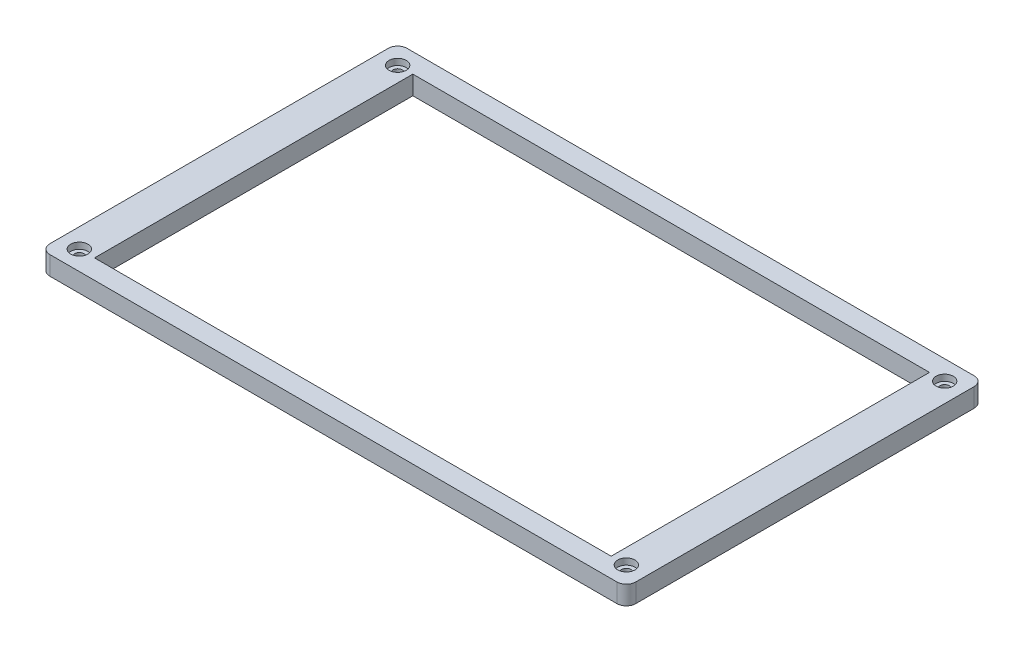
ISO-10303-21;
HEADER;
FILE_DESCRIPTION(('STEP AP214'),'2;1');
FILE_NAME('part.step','',(''),(''),'','','');
FILE_SCHEMA(('AUTOMOTIVE_DESIGN { 1 0 10303 214 1 1 1 1 }'));
ENDSEC;
DATA;
#1=APPLICATION_CONTEXT('core data for automotive mechanical design processes');
#2=APPLICATION_PROTOCOL_DEFINITION('international standard','automotive_design',2000,#1);
#3=PRODUCT_CONTEXT('',#1,'mechanical');
#4=PRODUCT('Part','Part','',(#3));
#5=PRODUCT_RELATED_PRODUCT_CATEGORY('part','',(#4));
#6=PRODUCT_DEFINITION_FORMATION('','',#4);
#7=PRODUCT_DEFINITION_CONTEXT('part definition',#1,'design');
#8=PRODUCT_DEFINITION('design','',#6,#7);
#9=PRODUCT_DEFINITION_SHAPE('','',#8);
#10=(LENGTH_UNIT() NAMED_UNIT(*) SI_UNIT(.MILLI.,.METRE.));
#11=(NAMED_UNIT(*) PLANE_ANGLE_UNIT() SI_UNIT($,.RADIAN.));
#12=(NAMED_UNIT(*) SI_UNIT($,.STERADIAN.) SOLID_ANGLE_UNIT());
#13=UNCERTAINTY_MEASURE_WITH_UNIT(LENGTH_MEASURE(1.E-05),#10,'distance_accuracy_value','');
#14=(GEOMETRIC_REPRESENTATION_CONTEXT(3) GLOBAL_UNCERTAINTY_ASSIGNED_CONTEXT((#13)) GLOBAL_UNIT_ASSIGNED_CONTEXT((#10,
#11,#12)) REPRESENTATION_CONTEXT('',''));
#15=CARTESIAN_POINT('',(0.,0.,0.));
#16=DIRECTION('',(0.,0.,1.));
#17=DIRECTION('',(1.,0.,0.));
#18=AXIS2_PLACEMENT_3D('',#15,#16,#17);
#19=CARTESIAN_POINT('',(87.5005621134574,0.,46.7348927078916));
#20=DIRECTION('',(0.,1.,0.));
#21=DIRECTION('',(0.,0.,1.));
#22=AXIS2_PLACEMENT_3D('',#19,#20,#21);
#23=CYLINDRICAL_SURFACE('',#22,1.5);
#24=CARTESIAN_POINT('',(87.5005621134574,0.,46.7348927078916));
#25=DIRECTION('',(0.,1.,0.));
#26=DIRECTION('',(0.,0.,1.));
#27=AXIS2_PLACEMENT_3D('',#24,#25,#26);
#28=CIRCLE('',#27,1.5);
#29=CARTESIAN_POINT('',(87.5005621134574,0.,48.2348927078916));
#30=VERTEX_POINT('',#29);
#31=EDGE_CURVE('E149',#30,#30,#28,.T.);
#32=ORIENTED_EDGE('',*,*,#31,.F.);
#33=EDGE_LOOP('',(#32));
#34=FACE_BOUND('',#33,.T.);
#35=CARTESIAN_POINT('',(87.5005621134574,4.,46.7348927078916));
#36=DIRECTION('',(0.,1.,0.));
#37=DIRECTION('',(0.,0.,1.));
#38=AXIS2_PLACEMENT_3D('',#35,#36,#37);
#39=CIRCLE('',#38,1.5);
#40=CARTESIAN_POINT('',(87.5005621134574,4.,48.2348927078916));
#41=VERTEX_POINT('',#40);
#42=EDGE_CURVE('E39',#41,#41,#39,.F.);
#43=ORIENTED_EDGE('',*,*,#42,.F.);
#44=EDGE_LOOP('',(#43));
#45=FACE_BOUND('',#44,.T.);
#46=ADVANCED_FACE('F35',(#34,#45),#23,.F.);
#47=CARTESIAN_POINT('',(-87.1001338479327,0.,-54.8655136929024));
#48=DIRECTION('',(0.,1.,0.));
#49=DIRECTION('',(0.,0.,1.));
#50=AXIS2_PLACEMENT_3D('',#47,#48,#49);
#51=CYLINDRICAL_SURFACE('',#50,1.5);
#52=CARTESIAN_POINT('',(-87.1001338479327,0.,-54.8655136929024));
#53=DIRECTION('',(0.,1.,0.));
#54=DIRECTION('',(0.,0.,1.));
#55=AXIS2_PLACEMENT_3D('',#52,#53,#54);
#56=CIRCLE('',#55,1.5);
#57=CARTESIAN_POINT('',(-87.1001338479327,0.,-53.3655136929024));
#58=VERTEX_POINT('',#57);
#59=EDGE_CURVE('E232',#58,#58,#56,.T.);
#60=ORIENTED_EDGE('',*,*,#59,.F.);
#61=EDGE_LOOP('',(#60));
#62=FACE_BOUND('',#61,.T.);
#63=CARTESIAN_POINT('',(-87.1001338479327,4.,-54.8655136929024));
#64=DIRECTION('',(0.,1.,0.));
#65=DIRECTION('',(0.,0.,1.));
#66=AXIS2_PLACEMENT_3D('',#63,#64,#65);
#67=CIRCLE('',#66,1.5);
#68=CARTESIAN_POINT('',(-87.1001338479327,4.,-53.3655136929024));
#69=VERTEX_POINT('',#68);
#70=EDGE_CURVE('E227',#69,#69,#67,.F.);
#71=ORIENTED_EDGE('',*,*,#70,.F.);
#72=EDGE_LOOP('',(#71));
#73=FACE_BOUND('',#72,.T.);
#74=ADVANCED_FACE('F255',(#62,#73),#51,.F.);
#75=CARTESIAN_POINT('',(-93.2997858672377,6.,-61.0653104925054));
#76=DIRECTION('',(1.,0.,0.));
#77=DIRECTION('',(0.,0.,-1.));
#78=AXIS2_PLACEMENT_3D('',#75,#76,#77);
#79=PLANE('',#78);
#80=DIRECTION('',(0.,0.,1.));
#81=VECTOR('',#80,1.);
#82=CARTESIAN_POINT('',(-93.2997858672377,6.,-61.0653104925054));
#83=LINE('',#82,#81);
#84=CARTESIAN_POINT('',(-93.2997858672377,6.,-58.0653104925054));
#85=VERTEX_POINT('',#84);
#86=CARTESIAN_POINT('',(-93.2997858672376,6.,49.9346895074946));
#87=VERTEX_POINT('',#86);
#88=EDGE_CURVE('E165',#85,#87,#83,.T.);
#89=ORIENTED_EDGE('',*,*,#88,.F.);
#90=DIRECTION('',(0.,-1.,0.));
#91=VECTOR('',#90,1.);
#92=CARTESIAN_POINT('',(-93.2997858672377,6.,-58.0653104925054));
#93=LINE('',#92,#91);
#94=CARTESIAN_POINT('',(-93.2997858672377,0.,-58.0653104925054));
#95=VERTEX_POINT('',#94);
#96=EDGE_CURVE('E190',#85,#95,#93,.T.);
#97=ORIENTED_EDGE('',*,*,#96,.T.);
#98=DIRECTION('',(0.,0.,1.));
#99=VECTOR('',#98,1.);
#100=CARTESIAN_POINT('',(-93.2997858672377,0.,-61.0653104925054));
#101=LINE('',#100,#99);
#102=CARTESIAN_POINT('',(-93.2997858672376,0.,49.9346895074946));
#103=VERTEX_POINT('',#102);
#104=EDGE_CURVE('E161',#95,#103,#101,.T.);
#105=ORIENTED_EDGE('',*,*,#104,.T.);
#106=DIRECTION('',(0.,-1.,0.));
#107=VECTOR('',#106,1.);
#108=CARTESIAN_POINT('',(-93.2997858672376,6.,49.9346895074946));
#109=LINE('',#108,#107);
#110=EDGE_CURVE('E178',#103,#87,#109,.F.);
#111=ORIENTED_EDGE('',*,*,#110,.T.);
#112=EDGE_LOOP('',(#89,#97,#105,#111));
#113=FACE_BOUND('',#112,.T.);
#114=ADVANCED_FACE('F261',(#113),#79,.F.);
#115=CARTESIAN_POINT('',(-93.2997858672376,6.,52.9346895074947));
#116=DIRECTION('',(0.,0.,-1.));
#117=DIRECTION('',(-1.,0.,0.));
#118=AXIS2_PLACEMENT_3D('',#115,#116,#117);
#119=PLANE('',#118);
#120=DIRECTION('',(1.,0.,0.));
#121=VECTOR('',#120,1.);
#122=CARTESIAN_POINT('',(-93.2997858672376,0.,52.9346895074947));
#123=LINE('',#122,#121);
#124=CARTESIAN_POINT('',(-90.2997858672376,0.,52.9346895074947));
#125=VERTEX_POINT('',#124);
#126=CARTESIAN_POINT('',(90.7002141327624,0.,52.9346895074947));
#127=VERTEX_POINT('',#126);
#128=EDGE_CURVE('E181',#125,#127,#123,.T.);
#129=ORIENTED_EDGE('',*,*,#128,.T.);
#130=DIRECTION('',(0.,-1.,0.));
#131=VECTOR('',#130,1.);
#132=CARTESIAN_POINT('',(90.7002141327624,6.,52.9346895074947));
#133=LINE('',#132,#131);
#134=CARTESIAN_POINT('',(90.7002141327624,6.,52.9346895074947));
#135=VERTEX_POINT('',#134);
#136=EDGE_CURVE('E11',#127,#135,#133,.F.);
#137=ORIENTED_EDGE('',*,*,#136,.T.);
#138=DIRECTION('',(1.,0.,0.));
#139=VECTOR('',#138,1.);
#140=CARTESIAN_POINT('',(-93.2997858672376,6.,52.9346895074947));
#141=LINE('',#140,#139);
#142=CARTESIAN_POINT('',(-90.2997858672376,6.,52.9346895074947));
#143=VERTEX_POINT('',#142);
#144=EDGE_CURVE('E168',#143,#135,#141,.T.);
#145=ORIENTED_EDGE('',*,*,#144,.F.);
#146=DIRECTION('',(0.,-1.,0.));
#147=VECTOR('',#146,1.);
#148=CARTESIAN_POINT('',(-90.2997858672376,6.,52.9346895074947));
#149=LINE('',#148,#147);
#150=EDGE_CURVE('E44',#143,#125,#149,.T.);
#151=ORIENTED_EDGE('',*,*,#150,.T.);
#152=EDGE_LOOP('',(#129,#137,#145,#151));
#153=FACE_BOUND('',#152,.T.);
#154=ADVANCED_FACE('F292',(#153),#119,.F.);
#155=CARTESIAN_POINT('',(93.7002141327623,6.,-61.0653104925054));
#156=DIRECTION('',(-1.,0.,0.));
#157=DIRECTION('',(0.,0.,1.));
#158=AXIS2_PLACEMENT_3D('',#155,#156,#157);
#159=PLANE('',#158);
#160=DIRECTION('',(0.,0.,-1.));
#161=VECTOR('',#160,1.);
#162=CARTESIAN_POINT('',(93.7002141327623,0.,-61.0653104925054));
#163=LINE('',#162,#161);
#164=CARTESIAN_POINT('',(93.7002141327623,0.,49.9346895074946));
#165=VERTEX_POINT('',#164);
#166=CARTESIAN_POINT('',(93.7002141327623,0.,-58.0653104925054));
#167=VERTEX_POINT('',#166);
#168=EDGE_CURVE('E184',#165,#167,#163,.T.);
#169=ORIENTED_EDGE('',*,*,#168,.T.);
#170=DIRECTION('',(0.,-1.,0.));
#171=VECTOR('',#170,1.);
#172=CARTESIAN_POINT('',(93.7002141327623,6.,-58.0653104925054));
#173=LINE('',#172,#171);
#174=CARTESIAN_POINT('',(93.7002141327623,6.,-58.0653104925054));
#175=VERTEX_POINT('',#174);
#176=EDGE_CURVE('E217',#167,#175,#173,.F.);
#177=ORIENTED_EDGE('',*,*,#176,.T.);
#178=DIRECTION('',(0.,0.,-1.));
#179=VECTOR('',#178,1.);
#180=CARTESIAN_POINT('',(93.7002141327623,6.,-61.0653104925054));
#181=LINE('',#180,#179);
#182=CARTESIAN_POINT('',(93.7002141327623,6.,49.9346895074946));
#183=VERTEX_POINT('',#182);
#184=EDGE_CURVE('E172',#183,#175,#181,.T.);
#185=ORIENTED_EDGE('',*,*,#184,.F.);
#186=DIRECTION('',(0.,-1.,0.));
#187=VECTOR('',#186,1.);
#188=CARTESIAN_POINT('',(93.7002141327623,6.,49.9346895074946));
#189=LINE('',#188,#187);
#190=EDGE_CURVE('E214',#183,#165,#189,.T.);
#191=ORIENTED_EDGE('',*,*,#190,.T.);
#192=EDGE_LOOP('',(#169,#177,#185,#191));
#193=FACE_BOUND('',#192,.T.);
#194=ADVANCED_FACE('F288',(#193),#159,.F.);
#195=CARTESIAN_POINT('',(-93.2997858672377,6.,-61.0653104925054));
#196=DIRECTION('',(0.,0.,1.));
#197=DIRECTION('',(1.,0.,0.));
#198=AXIS2_PLACEMENT_3D('',#195,#196,#197);
#199=PLANE('',#198);
#200=DIRECTION('',(-1.,0.,0.));
#201=VECTOR('',#200,1.);
#202=CARTESIAN_POINT('',(-93.2997858672377,0.,-61.0653104925054));
#203=LINE('',#202,#201);
#204=CARTESIAN_POINT('',(90.7002141327623,0.,-61.0653104925054));
#205=VERTEX_POINT('',#204);
#206=CARTESIAN_POINT('',(-90.2997858672377,0.,-61.0653104925054));
#207=VERTEX_POINT('',#206);
#208=EDGE_CURVE('E169',#205,#207,#203,.T.);
#209=ORIENTED_EDGE('',*,*,#208,.T.);
#210=DIRECTION('',(0.,-1.,0.));
#211=VECTOR('',#210,1.);
#212=CARTESIAN_POINT('',(-90.2997858672377,6.,-61.0653104925054));
#213=LINE('',#212,#211);
#214=CARTESIAN_POINT('',(-90.2997858672377,6.,-61.0653104925054));
#215=VERTEX_POINT('',#214);
#216=EDGE_CURVE('E204',#207,#215,#213,.F.);
#217=ORIENTED_EDGE('',*,*,#216,.T.);
#218=DIRECTION('',(-1.,0.,0.));
#219=VECTOR('',#218,1.);
#220=CARTESIAN_POINT('',(-93.2997858672377,6.,-61.0653104925054));
#221=LINE('',#220,#219);
#222=CARTESIAN_POINT('',(90.7002141327623,6.,-61.0653104925054));
#223=VERTEX_POINT('',#222);
#224=EDGE_CURVE('E175',#223,#215,#221,.T.);
#225=ORIENTED_EDGE('',*,*,#224,.F.);
#226=DIRECTION('',(0.,-1.,0.));
#227=VECTOR('',#226,1.);
#228=CARTESIAN_POINT('',(90.7002141327623,6.,-61.0653104925054));
#229=LINE('',#228,#227);
#230=EDGE_CURVE('E201',#223,#205,#229,.T.);
#231=ORIENTED_EDGE('',*,*,#230,.T.);
#232=EDGE_LOOP('',(#209,#217,#225,#231));
#233=FACE_BOUND('',#232,.T.);
#234=ADVANCED_FACE('F282',(#233),#199,.F.);
#235=CARTESIAN_POINT('',(0.,6.,0.));
#236=DIRECTION('',(0.,1.,0.));
#237=DIRECTION('',(0.,0.,1.));
#238=AXIS2_PLACEMENT_3D('',#235,#236,#237);
#239=PLANE('',#238);
#240=CARTESIAN_POINT('',(87.5002141327624,6.,-54.8653104925054));
#241=DIRECTION('',(0.,1.,0.));
#242=DIRECTION('',(0.,0.,-1.));
#243=AXIS2_PLACEMENT_3D('',#240,#241,#242);
#244=CIRCLE('',#243,2.75000000000001);
#245=CARTESIAN_POINT('',(87.5002141327624,6.,-57.6153104925054));
#246=VERTEX_POINT('',#245);
#247=EDGE_CURVE('E475',#246,#246,#244,.T.);
#248=ORIENTED_EDGE('',*,*,#247,.F.);
#249=EDGE_LOOP('',(#248));
#250=FACE_BOUND('',#249,.T.);
#251=CARTESIAN_POINT('',(-87.0997858672376,6.,46.7346895074947));
#252=DIRECTION('',(0.,1.,0.));
#253=DIRECTION('',(0.,0.,-1.));
#254=AXIS2_PLACEMENT_3D('',#251,#252,#253);
#255=CIRCLE('',#254,2.75000000000001);
#256=CARTESIAN_POINT('',(-87.0997858672376,6.,43.9846895074947));
#257=VERTEX_POINT('',#256);
#258=EDGE_CURVE('E469',#257,#257,#255,.T.);
#259=ORIENTED_EDGE('',*,*,#258,.F.);
#260=EDGE_LOOP('',(#259));
#261=FACE_BOUND('',#260,.T.);
#262=CARTESIAN_POINT('',(87.5002141327624,6.,46.7346895074947));
#263=DIRECTION('',(0.,1.,0.));
#264=DIRECTION('',(0.,0.,1.));
#265=AXIS2_PLACEMENT_3D('',#262,#263,#264);
#266=CIRCLE('',#265,2.75000000000001);
#267=CARTESIAN_POINT('',(87.5002141327624,6.,49.4846895074947));
#268=VERTEX_POINT('',#267);
#269=EDGE_CURVE('E466',#268,#268,#266,.T.);
#270=ORIENTED_EDGE('',*,*,#269,.F.);
#271=EDGE_LOOP('',(#270));
#272=FACE_BOUND('',#271,.T.);
#273=CARTESIAN_POINT('',(-87.0997858672376,6.,-54.8653104925054));
#274=DIRECTION('',(0.,1.,0.));
#275=DIRECTION('',(0.,0.,1.));
#276=AXIS2_PLACEMENT_3D('',#273,#274,#275);
#277=CIRCLE('',#276,2.75000000000001);
#278=CARTESIAN_POINT('',(-87.0997858672376,6.,-52.1153104925053));
#279=VERTEX_POINT('',#278);
#280=EDGE_CURVE('E244',#279,#279,#277,.T.);
#281=ORIENTED_EDGE('',*,*,#280,.F.);
#282=EDGE_LOOP('',(#281));
#283=FACE_BOUND('',#282,.T.);
#284=DIRECTION('',(0.,0.,1.));
#285=VECTOR('',#284,1.);
#286=CARTESIAN_POINT('',(-82.2494378865426,6.,-54.8653104925053));
#287=LINE('',#286,#285);
#288=CARTESIAN_POINT('',(-82.2494378865426,6.,-54.8653104925053));
#289=VERTEX_POINT('',#288);
#290=CARTESIAN_POINT('',(-82.2494378865426,6.,46.7346895074946));
#291=VERTEX_POINT('',#290);
#292=EDGE_CURVE('E52',#289,#291,#287,.T.);
#293=ORIENTED_EDGE('',*,*,#292,.F.);
#294=DIRECTION('',(-1.,0.,0.));
#295=VECTOR('',#294,1.);
#296=CARTESIAN_POINT('',(-82.2494378865426,6.,-54.8653104925053));
#297=LINE('',#296,#295);
#298=CARTESIAN_POINT('',(82.6505621134574,6.,-54.8653104925053));
#299=VERTEX_POINT('',#298);
#300=EDGE_CURVE('E143',#299,#289,#297,.T.);
#301=ORIENTED_EDGE('',*,*,#300,.F.);
#302=DIRECTION('',(0.,0.,-1.));
#303=VECTOR('',#302,1.);
#304=CARTESIAN_POINT('',(82.6505621134574,6.,-54.8653104925053));
#305=LINE('',#304,#303);
#306=CARTESIAN_POINT('',(82.6505621134574,6.,46.7346895074946));
#307=VERTEX_POINT('',#306);
#308=EDGE_CURVE('E146',#307,#299,#305,.T.);
#309=ORIENTED_EDGE('',*,*,#308,.F.);
#310=DIRECTION('',(1.,0.,0.));
#311=VECTOR('',#310,1.);
#312=CARTESIAN_POINT('',(-82.2494378865426,6.,46.7346895074946));
#313=LINE('',#312,#311);
#314=EDGE_CURVE('E155',#291,#307,#313,.T.);
#315=ORIENTED_EDGE('',*,*,#314,.F.);
#316=EDGE_LOOP('',(#293,#301,#309,#315));
#317=FACE_BOUND('',#316,.T.);
#318=ORIENTED_EDGE('',*,*,#224,.T.);
#319=CARTESIAN_POINT('',(-90.2997858672377,6.,-58.0653104925054));
#320=DIRECTION('',(0.,1.,0.));
#321=DIRECTION('',(0.,0.,1.));
#322=AXIS2_PLACEMENT_3D('',#319,#320,#321);
#323=CIRCLE('',#322,3.);
#324=EDGE_CURVE('E212',#215,#85,#323,.T.);
#325=ORIENTED_EDGE('',*,*,#324,.T.);
#326=ORIENTED_EDGE('',*,*,#88,.T.);
#327=CARTESIAN_POINT('',(-90.2997858672376,6.,49.9346895074946));
#328=DIRECTION('',(0.,1.,0.));
#329=DIRECTION('',(0.,0.,1.));
#330=AXIS2_PLACEMENT_3D('',#327,#328,#329);
#331=CIRCLE('',#330,3.);
#332=EDGE_CURVE('E206',#87,#143,#331,.T.);
#333=ORIENTED_EDGE('',*,*,#332,.T.);
#334=ORIENTED_EDGE('',*,*,#144,.T.);
#335=CARTESIAN_POINT('',(90.7002141327623,6.,49.9346895074946));
#336=DIRECTION('',(0.,1.,0.));
#337=DIRECTION('',(0.,0.,1.));
#338=AXIS2_PLACEMENT_3D('',#335,#336,#337);
#339=CIRCLE('',#338,3.);
#340=EDGE_CURVE('E208',#135,#183,#339,.T.);
#341=ORIENTED_EDGE('',*,*,#340,.T.);
#342=ORIENTED_EDGE('',*,*,#184,.T.);
#343=CARTESIAN_POINT('',(90.7002141327623,6.,-58.0653104925054));
#344=DIRECTION('',(0.,1.,0.));
#345=DIRECTION('',(0.,0.,1.));
#346=AXIS2_PLACEMENT_3D('',#343,#344,#345);
#347=CIRCLE('',#346,3.);
#348=EDGE_CURVE('E210',#175,#223,#347,.T.);
#349=ORIENTED_EDGE('',*,*,#348,.T.);
#350=EDGE_LOOP('',(#318,#325,#326,#333,#334,#341,#342,#349));
#351=FACE_BOUND('',#350,.T.);
#352=ADVANCED_FACE('F279',(#250,#261,#272,#283,#317,#351),#239,.T.);
#353=CARTESIAN_POINT('',(0.,0.,0.));
#354=DIRECTION('',(0.,1.,0.));
#355=DIRECTION('',(0.,0.,1.));
#356=AXIS2_PLACEMENT_3D('',#353,#354,#355);
#357=PLANE('',#356);
#358=CARTESIAN_POINT('',(87.5005621134574,0.,-54.8655136929024));
#359=DIRECTION('',(0.,1.,0.));
#360=DIRECTION('',(0.,0.,-1.));
#361=AXIS2_PLACEMENT_3D('',#358,#359,#360);
#362=CIRCLE('',#361,1.5);
#363=CARTESIAN_POINT('',(87.5005621134574,0.,-56.3655136929024));
#364=VERTEX_POINT('',#363);
#365=EDGE_CURVE('E241',#364,#364,#362,.T.);
#366=ORIENTED_EDGE('',*,*,#365,.T.);
#367=EDGE_LOOP('',(#366));
#368=FACE_BOUND('',#367,.T.);
#369=CARTESIAN_POINT('',(-87.1001338479327,0.,46.7348927078916));
#370=DIRECTION('',(0.,1.,0.));
#371=DIRECTION('',(0.,0.,-1.));
#372=AXIS2_PLACEMENT_3D('',#369,#370,#371);
#373=CIRCLE('',#372,1.5);
#374=CARTESIAN_POINT('',(-87.1001338479327,0.,45.2348927078916));
#375=VERTEX_POINT('',#374);
#376=EDGE_CURVE('E236',#375,#375,#373,.T.);
#377=ORIENTED_EDGE('',*,*,#376,.T.);
#378=EDGE_LOOP('',(#377));
#379=FACE_BOUND('',#378,.T.);
#380=ORIENTED_EDGE('',*,*,#59,.T.);
#381=EDGE_LOOP('',(#380));
#382=FACE_BOUND('',#381,.T.);
#383=ORIENTED_EDGE('',*,*,#31,.T.);
#384=EDGE_LOOP('',(#383));
#385=FACE_BOUND('',#384,.T.);
#386=DIRECTION('',(-1.,0.,0.));
#387=VECTOR('',#386,1.);
#388=CARTESIAN_POINT('',(-82.2494378865426,0.,-54.8653104925053));
#389=LINE('',#388,#387);
#390=CARTESIAN_POINT('',(82.6505621134574,0.,-54.8653104925053));
#391=VERTEX_POINT('',#390);
#392=CARTESIAN_POINT('',(-82.2494378865426,0.,-54.8653104925053));
#393=VERTEX_POINT('',#392);
#394=EDGE_CURVE('E133',#391,#393,#389,.T.);
#395=ORIENTED_EDGE('',*,*,#394,.T.);
#396=DIRECTION('',(0.,0.,1.));
#397=VECTOR('',#396,1.);
#398=CARTESIAN_POINT('',(-82.2494378865426,0.,-54.8653104925053));
#399=LINE('',#398,#397);
#400=CARTESIAN_POINT('',(-82.2494378865426,0.,46.7346895074946));
#401=VERTEX_POINT('',#400);
#402=EDGE_CURVE('E127',#393,#401,#399,.T.);
#403=ORIENTED_EDGE('',*,*,#402,.T.);
#404=DIRECTION('',(1.,0.,0.));
#405=VECTOR('',#404,1.);
#406=CARTESIAN_POINT('',(-82.2494378865426,0.,46.7346895074946));
#407=LINE('',#406,#405);
#408=CARTESIAN_POINT('',(82.6505621134574,0.,46.7346895074946));
#409=VERTEX_POINT('',#408);
#410=EDGE_CURVE('E136',#401,#409,#407,.T.);
#411=ORIENTED_EDGE('',*,*,#410,.T.);
#412=DIRECTION('',(0.,0.,-1.));
#413=VECTOR('',#412,1.);
#414=CARTESIAN_POINT('',(82.6505621134574,0.,-54.8653104925053));
#415=LINE('',#414,#413);
#416=EDGE_CURVE('E60',#409,#391,#415,.T.);
#417=ORIENTED_EDGE('',*,*,#416,.T.);
#418=EDGE_LOOP('',(#395,#403,#411,#417));
#419=FACE_BOUND('',#418,.T.);
#420=ORIENTED_EDGE('',*,*,#104,.F.);
#421=CARTESIAN_POINT('',(-90.2997858672377,0.,-58.0653104925054));
#422=DIRECTION('',(0.,1.,0.));
#423=DIRECTION('',(0.,0.,1.));
#424=AXIS2_PLACEMENT_3D('',#421,#422,#423);
#425=CIRCLE('',#424,3.);
#426=EDGE_CURVE('E199',#95,#207,#425,.F.);
#427=ORIENTED_EDGE('',*,*,#426,.T.);
#428=ORIENTED_EDGE('',*,*,#208,.F.);
#429=CARTESIAN_POINT('',(90.7002141327623,0.,-58.0653104925054));
#430=DIRECTION('',(0.,1.,0.));
#431=DIRECTION('',(0.,0.,1.));
#432=AXIS2_PLACEMENT_3D('',#429,#430,#431);
#433=CIRCLE('',#432,3.);
#434=EDGE_CURVE('E197',#205,#167,#433,.F.);
#435=ORIENTED_EDGE('',*,*,#434,.T.);
#436=ORIENTED_EDGE('',*,*,#168,.F.);
#437=CARTESIAN_POINT('',(90.7002141327623,0.,49.9346895074946));
#438=DIRECTION('',(0.,1.,0.));
#439=DIRECTION('',(0.,0.,1.));
#440=AXIS2_PLACEMENT_3D('',#437,#438,#439);
#441=CIRCLE('',#440,3.);
#442=EDGE_CURVE('E195',#165,#127,#441,.F.);
#443=ORIENTED_EDGE('',*,*,#442,.T.);
#444=ORIENTED_EDGE('',*,*,#128,.F.);
#445=CARTESIAN_POINT('',(-90.2997858672376,0.,49.9346895074946));
#446=DIRECTION('',(0.,1.,0.));
#447=DIRECTION('',(0.,0.,1.));
#448=AXIS2_PLACEMENT_3D('',#445,#446,#447);
#449=CIRCLE('',#448,3.);
#450=EDGE_CURVE('E193',#125,#103,#449,.F.);
#451=ORIENTED_EDGE('',*,*,#450,.T.);
#452=EDGE_LOOP('',(#420,#427,#428,#435,#436,#443,#444,#451));
#453=FACE_BOUND('',#452,.T.);
#454=ADVANCED_FACE('F140',(#368,#379,#382,#385,#419,#453),#357,.F.);
#455=CARTESIAN_POINT('',(-90.2997858672377,6.,-58.0653104925054));
#456=DIRECTION('',(0.,-1.,0.));
#457=DIRECTION('',(0.,0.,-1.));
#458=AXIS2_PLACEMENT_3D('',#455,#456,#457);
#459=CYLINDRICAL_SURFACE('',#458,3.);
#460=ORIENTED_EDGE('',*,*,#324,.F.);
#461=ORIENTED_EDGE('',*,*,#216,.F.);
#462=ORIENTED_EDGE('',*,*,#426,.F.);
#463=ORIENTED_EDGE('',*,*,#96,.F.);
#464=EDGE_LOOP('',(#460,#461,#462,#463));
#465=FACE_BOUND('',#464,.T.);
#466=ADVANCED_FACE('F285',(#465),#459,.T.);
#467=CARTESIAN_POINT('',(90.7002141327623,6.,-58.0653104925054));
#468=DIRECTION('',(0.,-1.,0.));
#469=DIRECTION('',(0.,0.,-1.));
#470=AXIS2_PLACEMENT_3D('',#467,#468,#469);
#471=CYLINDRICAL_SURFACE('',#470,3.);
#472=ORIENTED_EDGE('',*,*,#348,.F.);
#473=ORIENTED_EDGE('',*,*,#176,.F.);
#474=ORIENTED_EDGE('',*,*,#434,.F.);
#475=ORIENTED_EDGE('',*,*,#230,.F.);
#476=EDGE_LOOP('',(#472,#473,#474,#475));
#477=FACE_BOUND('',#476,.T.);
#478=ADVANCED_FACE('F302',(#477),#471,.T.);
#479=CARTESIAN_POINT('',(90.7002141327623,6.,49.9346895074946));
#480=DIRECTION('',(0.,-1.,0.));
#481=DIRECTION('',(0.,0.,-1.));
#482=AXIS2_PLACEMENT_3D('',#479,#480,#481);
#483=CYLINDRICAL_SURFACE('',#482,3.);
#484=ORIENTED_EDGE('',*,*,#340,.F.);
#485=ORIENTED_EDGE('',*,*,#136,.F.);
#486=ORIENTED_EDGE('',*,*,#442,.F.);
#487=ORIENTED_EDGE('',*,*,#190,.F.);
#488=EDGE_LOOP('',(#484,#485,#486,#487));
#489=FACE_BOUND('',#488,.T.);
#490=ADVANCED_FACE('F305',(#489),#483,.T.);
#491=CARTESIAN_POINT('',(-90.2997858672376,6.,49.9346895074946));
#492=DIRECTION('',(0.,-1.,0.));
#493=DIRECTION('',(0.,0.,-1.));
#494=AXIS2_PLACEMENT_3D('',#491,#492,#493);
#495=CYLINDRICAL_SURFACE('',#494,3.);
#496=ORIENTED_EDGE('',*,*,#332,.F.);
#497=ORIENTED_EDGE('',*,*,#110,.F.);
#498=ORIENTED_EDGE('',*,*,#450,.F.);
#499=ORIENTED_EDGE('',*,*,#150,.F.);
#500=EDGE_LOOP('',(#496,#497,#498,#499));
#501=FACE_BOUND('',#500,.T.);
#502=ADVANCED_FACE('F37',(#501),#495,.T.);
#503=CARTESIAN_POINT('',(-82.2494378865426,0.,-54.8653104925053));
#504=DIRECTION('',(-1.,0.,0.));
#505=DIRECTION('',(0.,0.,1.));
#506=AXIS2_PLACEMENT_3D('',#503,#504,#505);
#507=PLANE('',#506);
#508=ORIENTED_EDGE('',*,*,#292,.T.);
#509=DIRECTION('',(0.,1.,0.));
#510=VECTOR('',#509,1.);
#511=CARTESIAN_POINT('',(-82.2494378865426,0.,46.7346895074946));
#512=LINE('',#511,#510);
#513=EDGE_CURVE('E123',#401,#291,#512,.T.);
#514=ORIENTED_EDGE('',*,*,#513,.F.);
#515=ORIENTED_EDGE('',*,*,#402,.F.);
#516=DIRECTION('',(0.,1.,0.));
#517=VECTOR('',#516,1.);
#518=CARTESIAN_POINT('',(-82.2494378865426,0.,-54.8653104925053));
#519=LINE('',#518,#517);
#520=EDGE_CURVE('E159',#393,#289,#519,.T.);
#521=ORIENTED_EDGE('',*,*,#520,.T.);
#522=EDGE_LOOP('',(#508,#514,#515,#521));
#523=FACE_BOUND('',#522,.T.);
#524=ADVANCED_FACE('F125',(#523),#507,.F.);
#525=CARTESIAN_POINT('',(-82.2494378865426,0.,-54.8653104925053));
#526=DIRECTION('',(0.,0.,-1.));
#527=DIRECTION('',(-1.,0.,0.));
#528=AXIS2_PLACEMENT_3D('',#525,#526,#527);
#529=PLANE('',#528);
#530=ORIENTED_EDGE('',*,*,#300,.T.);
#531=ORIENTED_EDGE('',*,*,#520,.F.);
#532=ORIENTED_EDGE('',*,*,#394,.F.);
#533=DIRECTION('',(0.,1.,0.));
#534=VECTOR('',#533,1.);
#535=CARTESIAN_POINT('',(82.6505621134574,0.,-54.8653104925053));
#536=LINE('',#535,#534);
#537=EDGE_CURVE('E162',#391,#299,#536,.T.);
#538=ORIENTED_EDGE('',*,*,#537,.T.);
#539=EDGE_LOOP('',(#530,#531,#532,#538));
#540=FACE_BOUND('',#539,.T.);
#541=ADVANCED_FACE('F268',(#540),#529,.F.);
#542=CARTESIAN_POINT('',(82.6505621134574,0.,-54.8653104925053));
#543=DIRECTION('',(1.,0.,0.));
#544=DIRECTION('',(0.,0.,-1.));
#545=AXIS2_PLACEMENT_3D('',#542,#543,#544);
#546=PLANE('',#545);
#547=ORIENTED_EDGE('',*,*,#308,.T.);
#548=ORIENTED_EDGE('',*,*,#537,.F.);
#549=ORIENTED_EDGE('',*,*,#416,.F.);
#550=DIRECTION('',(0.,1.,0.));
#551=VECTOR('',#550,1.);
#552=CARTESIAN_POINT('',(82.6505621134574,0.,46.7346895074946));
#553=LINE('',#552,#551);
#554=EDGE_CURVE('E132',#409,#307,#553,.T.);
#555=ORIENTED_EDGE('',*,*,#554,.T.);
#556=EDGE_LOOP('',(#547,#548,#549,#555));
#557=FACE_BOUND('',#556,.T.);
#558=ADVANCED_FACE('F271',(#557),#546,.F.);
#559=CARTESIAN_POINT('',(-82.2494378865426,0.,46.7346895074946));
#560=DIRECTION('',(0.,0.,1.));
#561=DIRECTION('',(1.,0.,0.));
#562=AXIS2_PLACEMENT_3D('',#559,#560,#561);
#563=PLANE('',#562);
#564=ORIENTED_EDGE('',*,*,#314,.T.);
#565=ORIENTED_EDGE('',*,*,#554,.F.);
#566=ORIENTED_EDGE('',*,*,#410,.F.);
#567=ORIENTED_EDGE('',*,*,#513,.T.);
#568=EDGE_LOOP('',(#564,#565,#566,#567));
#569=FACE_BOUND('',#568,.T.);
#570=ADVANCED_FACE('F137',(#569),#563,.F.);
#571=CARTESIAN_POINT('',(-87.1001338479327,0.,46.7348927078916));
#572=DIRECTION('',(0.,1.,0.));
#573=DIRECTION('',(0.,0.,1.));
#574=AXIS2_PLACEMENT_3D('',#571,#572,#573);
#575=CYLINDRICAL_SURFACE('',#574,1.5);
#576=CARTESIAN_POINT('',(-87.1001338479327,4.,46.7348927078916));
#577=DIRECTION('',(0.,-1.,0.));
#578=DIRECTION('',(0.,0.,-1.));
#579=AXIS2_PLACEMENT_3D('',#576,#577,#578);
#580=CIRCLE('',#579,1.5);
#581=CARTESIAN_POINT('',(-87.1001338479327,4.,45.2348927078916));
#582=VERTEX_POINT('',#581);
#583=EDGE_CURVE('E224',#582,#582,#580,.F.);
#584=ORIENTED_EDGE('',*,*,#583,.T.);
#585=EDGE_LOOP('',(#584));
#586=FACE_BOUND('',#585,.T.);
#587=ORIENTED_EDGE('',*,*,#376,.F.);
#588=EDGE_LOOP('',(#587));
#589=FACE_BOUND('',#588,.T.);
#590=ADVANCED_FACE('F266',(#586,#589),#575,.F.);
#591=CARTESIAN_POINT('',(87.5005621134574,0.,-54.8655136929024));
#592=DIRECTION('',(0.,1.,0.));
#593=DIRECTION('',(0.,0.,1.));
#594=AXIS2_PLACEMENT_3D('',#591,#592,#593);
#595=CYLINDRICAL_SURFACE('',#594,1.5);
#596=CARTESIAN_POINT('',(87.5005621134574,4.,-54.8655136929024));
#597=DIRECTION('',(0.,-1.,0.));
#598=DIRECTION('',(0.,0.,-1.));
#599=AXIS2_PLACEMENT_3D('',#596,#597,#598);
#600=CIRCLE('',#599,1.5);
#601=CARTESIAN_POINT('',(87.5005621134574,4.,-56.3655136929024));
#602=VERTEX_POINT('',#601);
#603=EDGE_CURVE('E221',#602,#602,#600,.F.);
#604=ORIENTED_EDGE('',*,*,#603,.T.);
#605=EDGE_LOOP('',(#604));
#606=FACE_BOUND('',#605,.T.);
#607=ORIENTED_EDGE('',*,*,#365,.F.);
#608=EDGE_LOOP('',(#607));
#609=FACE_BOUND('',#608,.T.);
#610=ADVANCED_FACE('F359',(#606,#609),#595,.F.);
#611=CARTESIAN_POINT('',(87.5002141327624,4.,-54.8653104925054));
#612=DIRECTION('',(0.,-1.,0.));
#613=DIRECTION('',(0.,0.,-1.));
#614=AXIS2_PLACEMENT_3D('',#611,#612,#613);
#615=PLANE('',#614);
#616=CARTESIAN_POINT('',(87.5002141327624,4.,-54.8653104925054));
#617=DIRECTION('',(0.,1.,0.));
#618=DIRECTION('',(0.,0.,-1.));
#619=AXIS2_PLACEMENT_3D('',#616,#617,#618);
#620=CIRCLE('',#619,2.75000000000001);
#621=CARTESIAN_POINT('',(87.5002141327624,4.,-57.6153104925054));
#622=VERTEX_POINT('',#621);
#623=EDGE_CURVE('E472',#622,#622,#620,.T.);
#624=ORIENTED_EDGE('',*,*,#623,.T.);
#625=EDGE_LOOP('',(#624));
#626=FACE_BOUND('',#625,.T.);
#627=ORIENTED_EDGE('',*,*,#603,.F.);
#628=EDGE_LOOP('',(#627));
#629=FACE_BOUND('',#628,.T.);
#630=ADVANCED_FACE('F368',(#626,#629),#615,.F.);
#631=CARTESIAN_POINT('',(87.5002141327624,4.,-54.8653104925054));
#632=DIRECTION('',(0.,1.,0.));
#633=DIRECTION('',(0.,0.,1.));
#634=AXIS2_PLACEMENT_3D('',#631,#632,#633);
#635=CYLINDRICAL_SURFACE('',#634,2.75000000000001);
#636=ORIENTED_EDGE('',*,*,#623,.F.);
#637=EDGE_LOOP('',(#636));
#638=FACE_BOUND('',#637,.T.);
#639=ORIENTED_EDGE('',*,*,#247,.T.);
#640=EDGE_LOOP('',(#639));
#641=FACE_BOUND('',#640,.T.);
#642=ADVANCED_FACE('F386',(#638,#641),#635,.F.);
#643=CARTESIAN_POINT('',(-87.0997858672376,4.,46.7346895074947));
#644=DIRECTION('',(0.,-1.,0.));
#645=DIRECTION('',(0.,0.,-1.));
#646=AXIS2_PLACEMENT_3D('',#643,#644,#645);
#647=PLANE('',#646);
#648=CARTESIAN_POINT('',(-87.0997858672376,4.,46.7346895074947));
#649=DIRECTION('',(0.,1.,0.));
#650=DIRECTION('',(0.,0.,-1.));
#651=AXIS2_PLACEMENT_3D('',#648,#649,#650);
#652=CIRCLE('',#651,2.75000000000001);
#653=CARTESIAN_POINT('',(-87.0997858672376,4.,43.9846895074947));
#654=VERTEX_POINT('',#653);
#655=EDGE_CURVE('E478',#654,#654,#652,.T.);
#656=ORIENTED_EDGE('',*,*,#655,.T.);
#657=EDGE_LOOP('',(#656));
#658=FACE_BOUND('',#657,.T.);
#659=ORIENTED_EDGE('',*,*,#583,.F.);
#660=EDGE_LOOP('',(#659));
#661=FACE_BOUND('',#660,.T.);
#662=ADVANCED_FACE('F393',(#658,#661),#647,.F.);
#663=CARTESIAN_POINT('',(-87.0997858672376,4.,46.7346895074947));
#664=DIRECTION('',(0.,1.,0.));
#665=DIRECTION('',(0.,0.,1.));
#666=AXIS2_PLACEMENT_3D('',#663,#664,#665);
#667=CYLINDRICAL_SURFACE('',#666,2.75000000000001);
#668=ORIENTED_EDGE('',*,*,#655,.F.);
#669=EDGE_LOOP('',(#668));
#670=FACE_BOUND('',#669,.T.);
#671=ORIENTED_EDGE('',*,*,#258,.T.);
#672=EDGE_LOOP('',(#671));
#673=FACE_BOUND('',#672,.T.);
#674=ADVANCED_FACE('F401',(#670,#673),#667,.F.);
#675=CARTESIAN_POINT('',(-87.0997858672376,4.,-54.8653104925054));
#676=DIRECTION('',(0.,1.,0.));
#677=DIRECTION('',(0.,0.,1.));
#678=AXIS2_PLACEMENT_3D('',#675,#676,#677);
#679=PLANE('',#678);
#680=CARTESIAN_POINT('',(-87.0997858672376,4.,-54.8653104925054));
#681=DIRECTION('',(0.,1.,0.));
#682=DIRECTION('',(0.,0.,1.));
#683=AXIS2_PLACEMENT_3D('',#680,#681,#682);
#684=CIRCLE('',#683,2.75000000000001);
#685=CARTESIAN_POINT('',(-87.0997858672376,4.,-52.1153104925053));
#686=VERTEX_POINT('',#685);
#687=EDGE_CURVE('E225',#686,#686,#684,.T.);
#688=ORIENTED_EDGE('',*,*,#687,.T.);
#689=EDGE_LOOP('',(#688));
#690=FACE_BOUND('',#689,.T.);
#691=ORIENTED_EDGE('',*,*,#70,.T.);
#692=EDGE_LOOP('',(#691));
#693=FACE_BOUND('',#692,.T.);
#694=ADVANCED_FACE('F409',(#690,#693),#679,.T.);
#695=CARTESIAN_POINT('',(-87.0997858672376,4.,-54.8653104925054));
#696=DIRECTION('',(0.,1.,0.));
#697=DIRECTION('',(0.,0.,1.));
#698=AXIS2_PLACEMENT_3D('',#695,#696,#697);
#699=CYLINDRICAL_SURFACE('',#698,2.75000000000001);
#700=ORIENTED_EDGE('',*,*,#687,.F.);
#701=EDGE_LOOP('',(#700));
#702=FACE_BOUND('',#701,.T.);
#703=ORIENTED_EDGE('',*,*,#280,.T.);
#704=EDGE_LOOP('',(#703));
#705=FACE_BOUND('',#704,.T.);
#706=ADVANCED_FACE('F417',(#702,#705),#699,.F.);
#707=CARTESIAN_POINT('',(87.5002141327624,4.,46.7346895074947));
#708=DIRECTION('',(0.,1.,0.));
#709=DIRECTION('',(0.,0.,1.));
#710=AXIS2_PLACEMENT_3D('',#707,#708,#709);
#711=PLANE('',#710);
#712=CARTESIAN_POINT('',(87.5002141327624,4.,46.7346895074947));
#713=DIRECTION('',(0.,1.,0.));
#714=DIRECTION('',(0.,0.,1.));
#715=AXIS2_PLACEMENT_3D('',#712,#713,#714);
#716=CIRCLE('',#715,2.75000000000001);
#717=CARTESIAN_POINT('',(87.5002141327624,4.,49.4846895074947));
#718=VERTEX_POINT('',#717);
#719=EDGE_CURVE('E463',#718,#718,#716,.T.);
#720=ORIENTED_EDGE('',*,*,#719,.T.);
#721=EDGE_LOOP('',(#720));
#722=FACE_BOUND('',#721,.T.);
#723=ORIENTED_EDGE('',*,*,#42,.T.);
#724=EDGE_LOOP('',(#723));
#725=FACE_BOUND('',#724,.T.);
#726=ADVANCED_FACE('F425',(#722,#725),#711,.T.);
#727=CARTESIAN_POINT('',(87.5002141327624,4.,46.7346895074947));
#728=DIRECTION('',(0.,1.,0.));
#729=DIRECTION('',(0.,0.,1.));
#730=AXIS2_PLACEMENT_3D('',#727,#728,#729);
#731=CYLINDRICAL_SURFACE('',#730,2.75000000000001);
#732=ORIENTED_EDGE('',*,*,#719,.F.);
#733=EDGE_LOOP('',(#732));
#734=FACE_BOUND('',#733,.T.);
#735=ORIENTED_EDGE('',*,*,#269,.T.);
#736=EDGE_LOOP('',(#735));
#737=FACE_BOUND('',#736,.T.);
#738=ADVANCED_FACE('F433',(#734,#737),#731,.F.);
#739=CLOSED_SHELL('',(#46,#74,#114,#154,#194,#234,#352,#454,#466,#478,#490,#502,#524,#541,#558,
#570,#590,#610,#630,#642,#662,#674,#694,#706,#726,#738));
#740=MANIFOLD_SOLID_BREP('B2',#739);
#741=ADVANCED_BREP_SHAPE_REPRESENTATION('',(#18,#740),#14);
#742=SHAPE_DEFINITION_REPRESENTATION(#9,#741);
ENDSEC;
END-ISO-10303-21;
